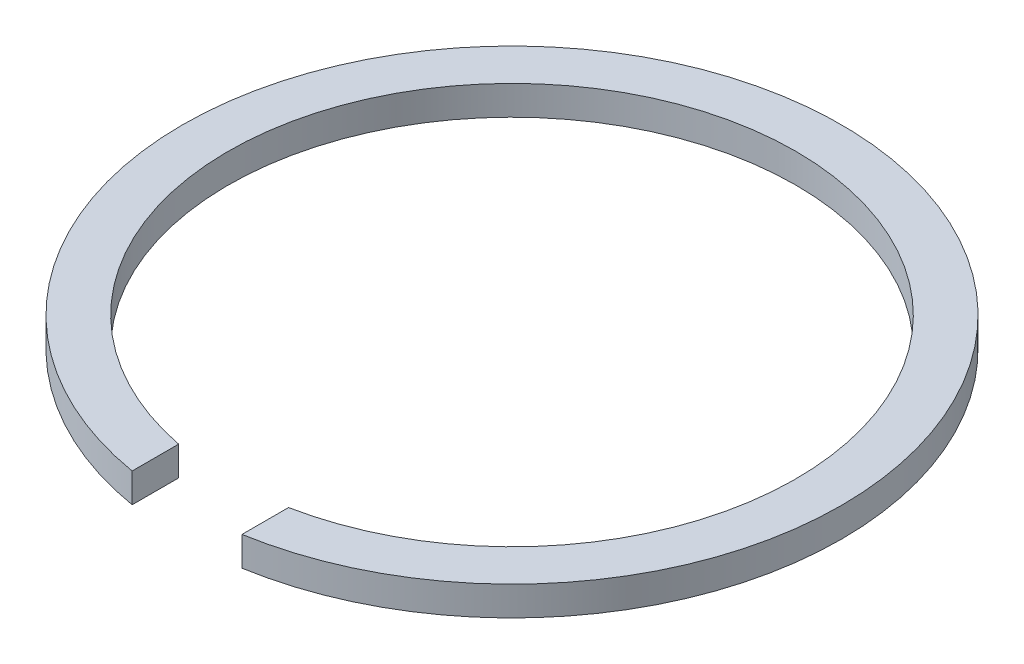
ISO-10303-21;
HEADER;
FILE_DESCRIPTION(('STEP AP214'),'2;1');
FILE_NAME('part.step','',(''),(''),'','','');
FILE_SCHEMA(('AUTOMOTIVE_DESIGN { 1 0 10303 214 1 1 1 1 }'));
ENDSEC;
DATA;
#1=APPLICATION_CONTEXT('core data for automotive mechanical design processes');
#2=APPLICATION_PROTOCOL_DEFINITION('international standard','automotive_design',2000,#1);
#3=PRODUCT_CONTEXT('',#1,'mechanical');
#4=PRODUCT('Part','Part','',(#3));
#5=PRODUCT_RELATED_PRODUCT_CATEGORY('part','',(#4));
#6=PRODUCT_DEFINITION_FORMATION('','',#4);
#7=PRODUCT_DEFINITION_CONTEXT('part definition',#1,'design');
#8=PRODUCT_DEFINITION('design','',#6,#7);
#9=PRODUCT_DEFINITION_SHAPE('','',#8);
#10=(LENGTH_UNIT() NAMED_UNIT(*) SI_UNIT(.MILLI.,.METRE.));
#11=(NAMED_UNIT(*) PLANE_ANGLE_UNIT() SI_UNIT($,.RADIAN.));
#12=(NAMED_UNIT(*) SI_UNIT($,.STERADIAN.) SOLID_ANGLE_UNIT());
#13=UNCERTAINTY_MEASURE_WITH_UNIT(LENGTH_MEASURE(1.E-05),#10,'distance_accuracy_value','');
#14=(GEOMETRIC_REPRESENTATION_CONTEXT(3) GLOBAL_UNCERTAINTY_ASSIGNED_CONTEXT((#13)) GLOBAL_UNIT_ASSIGNED_CONTEXT((#10,
#11,#12)) REPRESENTATION_CONTEXT('',''));
#15=CARTESIAN_POINT('',(0.,0.,0.));
#16=DIRECTION('',(0.,0.,1.));
#17=DIRECTION('',(1.,0.,0.));
#18=AXIS2_PLACEMENT_3D('',#15,#16,#17);
#19=CARTESIAN_POINT('',(1.5,0.8,8.87411967464942));
#20=DIRECTION('',(-1.,0.,0.));
#21=DIRECTION('',(0.,0.,1.));
#22=AXIS2_PLACEMENT_3D('',#19,#20,#21);
#23=PLANE('',#22);
#24=DIRECTION('',(0.,0.,-1.));
#25=VECTOR('',#24,1.);
#26=CARTESIAN_POINT('',(1.5,0.,8.87411967464942));
#27=LINE('',#26,#25);
#28=CARTESIAN_POINT('',(1.5,0.,8.87411967464942));
#29=VERTEX_POINT('',#28);
#30=CARTESIAN_POINT('',(1.5,0.,7.60345316287277));
#31=VERTEX_POINT('',#30);
#32=EDGE_CURVE('E97',#29,#31,#27,.T.);
#33=ORIENTED_EDGE('',*,*,#32,.F.);
#34=DIRECTION('',(0.,-1.,0.));
#35=VECTOR('',#34,1.);
#36=CARTESIAN_POINT('',(1.5,0.8,8.87411967464942));
#37=LINE('',#36,#35);
#38=CARTESIAN_POINT('',(1.5,0.8,8.87411967464942));
#39=VERTEX_POINT('',#38);
#40=EDGE_CURVE('E11',#39,#29,#37,.T.);
#41=ORIENTED_EDGE('',*,*,#40,.F.);
#42=DIRECTION('',(0.,0.,-1.));
#43=VECTOR('',#42,1.);
#44=CARTESIAN_POINT('',(1.5,0.8,8.87411967464942));
#45=LINE('',#44,#43);
#46=CARTESIAN_POINT('',(1.5,0.8,7.60345316287277));
#47=VERTEX_POINT('',#46);
#48=EDGE_CURVE('E92',#39,#47,#45,.T.);
#49=ORIENTED_EDGE('',*,*,#48,.T.);
#50=DIRECTION('',(0.,-1.,0.));
#51=VECTOR('',#50,1.);
#52=CARTESIAN_POINT('',(1.5,0.8,7.60345316287277));
#53=LINE('',#52,#51);
#54=EDGE_CURVE('E35',#47,#31,#53,.T.);
#55=ORIENTED_EDGE('',*,*,#54,.T.);
#56=EDGE_LOOP('',(#33,#41,#49,#55));
#57=FACE_BOUND('',#56,.T.);
#58=ADVANCED_FACE('F32',(#57),#23,.T.);
#59=CARTESIAN_POINT('',(0.,0.8,0.));
#60=DIRECTION('',(0.,-1.,0.));
#61=DIRECTION('',(0.,0.,-1.));
#62=AXIS2_PLACEMENT_3D('',#59,#60,#61);
#63=CYLINDRICAL_SURFACE('',#62,9.);
#64=CARTESIAN_POINT('',(0.,0.,0.));
#65=DIRECTION('',(0.,1.,0.));
#66=DIRECTION('',(0.,0.,1.));
#67=AXIS2_PLACEMENT_3D('',#64,#65,#66);
#68=CIRCLE('',#67,9.);
#69=CARTESIAN_POINT('',(-1.5,0.,8.87411967464942));
#70=VERTEX_POINT('',#69);
#71=EDGE_CURVE('E65',#29,#70,#68,.T.);
#72=ORIENTED_EDGE('',*,*,#71,.T.);
#73=DIRECTION('',(0.,-1.,0.));
#74=VECTOR('',#73,1.);
#75=CARTESIAN_POINT('',(-1.5,0.8,8.87411967464942));
#76=LINE('',#75,#74);
#77=CARTESIAN_POINT('',(-1.5,0.8,8.87411967464942));
#78=VERTEX_POINT('',#77);
#79=EDGE_CURVE('E41',#78,#70,#76,.T.);
#80=ORIENTED_EDGE('',*,*,#79,.F.);
#81=CARTESIAN_POINT('',(0.,0.8,0.));
#82=DIRECTION('',(0.,1.,0.));
#83=DIRECTION('',(0.,0.,1.));
#84=AXIS2_PLACEMENT_3D('',#81,#82,#83);
#85=CIRCLE('',#84,9.);
#86=EDGE_CURVE('E82',#39,#78,#85,.T.);
#87=ORIENTED_EDGE('',*,*,#86,.F.);
#88=ORIENTED_EDGE('',*,*,#40,.T.);
#89=EDGE_LOOP('',(#72,#80,#87,#88));
#90=FACE_BOUND('',#89,.T.);
#91=ADVANCED_FACE('F107',(#90),#63,.T.);
#92=CARTESIAN_POINT('',(-1.5,0.8,8.87411967464942));
#93=DIRECTION('',(-1.,0.,0.));
#94=DIRECTION('',(0.,0.,1.));
#95=AXIS2_PLACEMENT_3D('',#92,#93,#94);
#96=PLANE('',#95);
#97=DIRECTION('',(0.,0.,-1.));
#98=VECTOR('',#97,1.);
#99=CARTESIAN_POINT('',(-1.5,0.,8.87411967464942));
#100=LINE('',#99,#98);
#101=CARTESIAN_POINT('',(-1.5,0.,7.60345316287277));
#102=VERTEX_POINT('',#101);
#103=EDGE_CURVE('E89',#70,#102,#100,.T.);
#104=ORIENTED_EDGE('',*,*,#103,.T.);
#105=DIRECTION('',(0.,-1.,0.));
#106=VECTOR('',#105,1.);
#107=CARTESIAN_POINT('',(-1.5,0.8,7.60345316287277));
#108=LINE('',#107,#106);
#109=CARTESIAN_POINT('',(-1.5,0.8,7.60345316287277));
#110=VERTEX_POINT('',#109);
#111=EDGE_CURVE('E86',#110,#102,#108,.T.);
#112=ORIENTED_EDGE('',*,*,#111,.F.);
#113=DIRECTION('',(0.,0.,-1.));
#114=VECTOR('',#113,1.);
#115=CARTESIAN_POINT('',(-1.5,0.8,8.87411967464942));
#116=LINE('',#115,#114);
#117=EDGE_CURVE('E77',#78,#110,#116,.T.);
#118=ORIENTED_EDGE('',*,*,#117,.F.);
#119=ORIENTED_EDGE('',*,*,#79,.T.);
#120=EDGE_LOOP('',(#104,#112,#118,#119));
#121=FACE_BOUND('',#120,.T.);
#122=ADVANCED_FACE('F87',(#121),#96,.F.);
#123=CARTESIAN_POINT('',(0.,0.8,0.));
#124=DIRECTION('',(0.,-1.,0.));
#125=DIRECTION('',(0.,0.,-1.));
#126=AXIS2_PLACEMENT_3D('',#123,#124,#125);
#127=CYLINDRICAL_SURFACE('',#126,7.75);
#128=CARTESIAN_POINT('',(0.,0.,0.));
#129=DIRECTION('',(0.,1.,0.));
#130=DIRECTION('',(0.,0.,1.));
#131=AXIS2_PLACEMENT_3D('',#128,#129,#130);
#132=CIRCLE('',#131,7.75);
#133=EDGE_CURVE('E100',#31,#102,#132,.T.);
#134=ORIENTED_EDGE('',*,*,#133,.F.);
#135=ORIENTED_EDGE('',*,*,#54,.F.);
#136=CARTESIAN_POINT('',(0.,0.8,0.));
#137=DIRECTION('',(0.,1.,0.));
#138=DIRECTION('',(0.,0.,1.));
#139=AXIS2_PLACEMENT_3D('',#136,#137,#138);
#140=CIRCLE('',#139,7.75);
#141=EDGE_CURVE('E81',#47,#110,#140,.T.);
#142=ORIENTED_EDGE('',*,*,#141,.T.);
#143=ORIENTED_EDGE('',*,*,#111,.T.);
#144=EDGE_LOOP('',(#134,#135,#142,#143));
#145=FACE_BOUND('',#144,.T.);
#146=ADVANCED_FACE('F91',(#145),#127,.F.);
#147=CARTESIAN_POINT('',(0.,0.8,0.));
#148=DIRECTION('',(0.,1.,0.));
#149=DIRECTION('',(0.,0.,1.));
#150=AXIS2_PLACEMENT_3D('',#147,#148,#149);
#151=PLANE('',#150);
#152=ORIENTED_EDGE('',*,*,#48,.F.);
#153=ORIENTED_EDGE('',*,*,#86,.T.);
#154=ORIENTED_EDGE('',*,*,#117,.T.);
#155=ORIENTED_EDGE('',*,*,#141,.F.);
#156=EDGE_LOOP('',(#152,#153,#154,#155));
#157=FACE_BOUND('',#156,.T.);
#158=ADVANCED_FACE('F80',(#157),#151,.T.);
#159=CARTESIAN_POINT('',(0.,0.,0.));
#160=DIRECTION('',(0.,1.,0.));
#161=DIRECTION('',(0.,0.,1.));
#162=AXIS2_PLACEMENT_3D('',#159,#160,#161);
#163=PLANE('',#162);
#164=ORIENTED_EDGE('',*,*,#32,.T.);
#165=ORIENTED_EDGE('',*,*,#133,.T.);
#166=ORIENTED_EDGE('',*,*,#103,.F.);
#167=ORIENTED_EDGE('',*,*,#71,.F.);
#168=EDGE_LOOP('',(#164,#165,#166,#167));
#169=FACE_BOUND('',#168,.T.);
#170=ADVANCED_FACE('F105',(#169),#163,.F.);
#171=CLOSED_SHELL('',(#58,#91,#122,#146,#158,#170));
#172=MANIFOLD_SOLID_BREP('B2',#171);
#173=ADVANCED_BREP_SHAPE_REPRESENTATION('',(#18,#172),#14);
#174=SHAPE_DEFINITION_REPRESENTATION(#9,#173);
ENDSEC;
END-ISO-10303-21;
